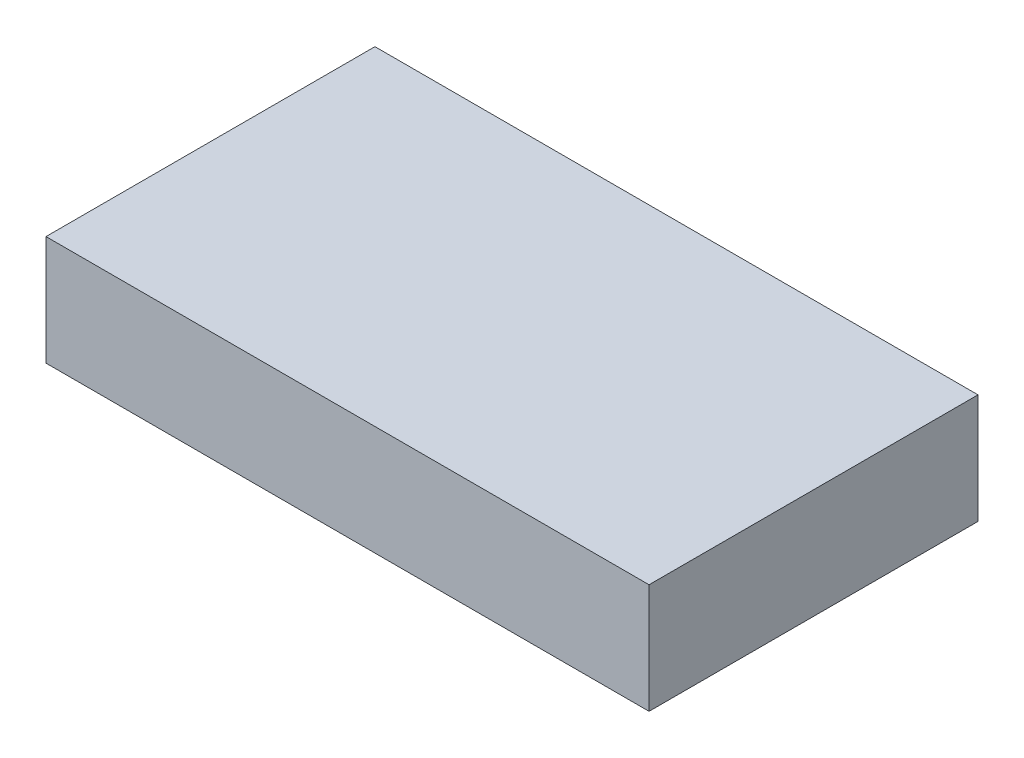
ISO-10303-21;
HEADER;
FILE_DESCRIPTION(('STEP AP214'),'2;1');
FILE_NAME('part.step','',(''),(''),'','','');
FILE_SCHEMA(('AUTOMOTIVE_DESIGN { 1 0 10303 214 1 1 1 1 }'));
ENDSEC;
DATA;
#1=APPLICATION_CONTEXT('core data for automotive mechanical design processes');
#2=APPLICATION_PROTOCOL_DEFINITION('international standard','automotive_design',2000,#1);
#3=PRODUCT_CONTEXT('',#1,'mechanical');
#4=PRODUCT('Part','Part','',(#3));
#5=PRODUCT_RELATED_PRODUCT_CATEGORY('part','',(#4));
#6=PRODUCT_DEFINITION_FORMATION('','',#4);
#7=PRODUCT_DEFINITION_CONTEXT('part definition',#1,'design');
#8=PRODUCT_DEFINITION('design','',#6,#7);
#9=PRODUCT_DEFINITION_SHAPE('','',#8);
#10=(LENGTH_UNIT() NAMED_UNIT(*) SI_UNIT(.MILLI.,.METRE.));
#11=(NAMED_UNIT(*) PLANE_ANGLE_UNIT() SI_UNIT($,.RADIAN.));
#12=(NAMED_UNIT(*) SI_UNIT($,.STERADIAN.) SOLID_ANGLE_UNIT());
#13=UNCERTAINTY_MEASURE_WITH_UNIT(LENGTH_MEASURE(1.E-05),#10,'distance_accuracy_value','');
#14=(GEOMETRIC_REPRESENTATION_CONTEXT(3) GLOBAL_UNCERTAINTY_ASSIGNED_CONTEXT((#13)) GLOBAL_UNIT_ASSIGNED_CONTEXT((#10,
#11,#12)) REPRESENTATION_CONTEXT('',''));
#15=CARTESIAN_POINT('',(0.,0.,0.));
#16=DIRECTION('',(0.,0.,1.));
#17=DIRECTION('',(1.,0.,0.));
#18=AXIS2_PLACEMENT_3D('',#15,#16,#17);
#19=CARTESIAN_POINT('',(0.,10.16,0.));
#20=DIRECTION('',(-1.,0.,0.));
#21=DIRECTION('',(0.,0.,1.));
#22=AXIS2_PLACEMENT_3D('',#19,#20,#21);
#23=PLANE('',#22);
#24=DIRECTION('',(0.,0.,-1.));
#25=VECTOR('',#24,1.);
#26=CARTESIAN_POINT('',(0.,0.,0.));
#27=LINE('',#26,#25);
#28=CARTESIAN_POINT('',(0.,0.,0.));
#29=VERTEX_POINT('',#28);
#30=CARTESIAN_POINT('',(0.,0.,-30.48));
#31=VERTEX_POINT('',#30);
#32=EDGE_CURVE('E106',#29,#31,#27,.T.);
#33=ORIENTED_EDGE('',*,*,#32,.T.);
#34=DIRECTION('',(0.,-1.,0.));
#35=VECTOR('',#34,1.);
#36=CARTESIAN_POINT('',(0.,10.16,-30.48));
#37=LINE('',#36,#35);
#38=CARTESIAN_POINT('',(0.,10.16,-30.48));
#39=VERTEX_POINT('',#38);
#40=EDGE_CURVE('E11',#39,#31,#37,.T.);
#41=ORIENTED_EDGE('',*,*,#40,.F.);
#42=DIRECTION('',(0.,0.,-1.));
#43=VECTOR('',#42,1.);
#44=CARTESIAN_POINT('',(0.,10.16,0.));
#45=LINE('',#44,#43);
#46=CARTESIAN_POINT('',(0.,10.16,0.));
#47=VERTEX_POINT('',#46);
#48=EDGE_CURVE('E94',#47,#39,#45,.T.);
#49=ORIENTED_EDGE('',*,*,#48,.F.);
#50=DIRECTION('',(0.,-1.,0.));
#51=VECTOR('',#50,1.);
#52=CARTESIAN_POINT('',(0.,10.16,0.));
#53=LINE('',#52,#51);
#54=EDGE_CURVE('E102',#47,#29,#53,.T.);
#55=ORIENTED_EDGE('',*,*,#54,.T.);
#56=EDGE_LOOP('',(#33,#41,#49,#55));
#57=FACE_BOUND('',#56,.T.);
#58=ADVANCED_FACE('F43',(#57),#23,.F.);
#59=CARTESIAN_POINT('',(0.,10.16,-30.48));
#60=DIRECTION('',(0.,0.,1.));
#61=DIRECTION('',(1.,0.,0.));
#62=AXIS2_PLACEMENT_3D('',#59,#60,#61);
#63=PLANE('',#62);
#64=DIRECTION('',(-1.,0.,0.));
#65=VECTOR('',#64,1.);
#66=CARTESIAN_POINT('',(0.,0.,-30.48));
#67=LINE('',#66,#65);
#68=CARTESIAN_POINT('',(-55.88,0.,-30.48));
#69=VERTEX_POINT('',#68);
#70=EDGE_CURVE('E98',#31,#69,#67,.T.);
#71=ORIENTED_EDGE('',*,*,#70,.T.);
#72=DIRECTION('',(0.,-1.,0.));
#73=VECTOR('',#72,1.);
#74=CARTESIAN_POINT('',(-55.88,10.16,-30.48));
#75=LINE('',#74,#73);
#76=CARTESIAN_POINT('',(-55.88,10.16,-30.48));
#77=VERTEX_POINT('',#76);
#78=EDGE_CURVE('E51',#77,#69,#75,.T.);
#79=ORIENTED_EDGE('',*,*,#78,.F.);
#80=DIRECTION('',(-1.,0.,0.));
#81=VECTOR('',#80,1.);
#82=CARTESIAN_POINT('',(0.,10.16,-30.48));
#83=LINE('',#82,#81);
#84=EDGE_CURVE('E89',#39,#77,#83,.T.);
#85=ORIENTED_EDGE('',*,*,#84,.F.);
#86=ORIENTED_EDGE('',*,*,#40,.T.);
#87=EDGE_LOOP('',(#71,#79,#85,#86));
#88=FACE_BOUND('',#87,.T.);
#89=ADVANCED_FACE('F97',(#88),#63,.F.);
#90=CARTESIAN_POINT('',(-55.88,10.16,0.));
#91=DIRECTION('',(1.,0.,0.));
#92=DIRECTION('',(0.,0.,-1.));
#93=AXIS2_PLACEMENT_3D('',#90,#91,#92);
#94=PLANE('',#93);
#95=DIRECTION('',(0.,0.,1.));
#96=VECTOR('',#95,1.);
#97=CARTESIAN_POINT('',(-55.88,0.,0.));
#98=LINE('',#97,#96);
#99=CARTESIAN_POINT('',(-55.88,0.,0.));
#100=VERTEX_POINT('',#99);
#101=EDGE_CURVE('E76',#69,#100,#98,.T.);
#102=ORIENTED_EDGE('',*,*,#101,.T.);
#103=DIRECTION('',(0.,-1.,0.));
#104=VECTOR('',#103,1.);
#105=CARTESIAN_POINT('',(-55.88,10.16,0.));
#106=LINE('',#105,#104);
#107=CARTESIAN_POINT('',(-55.88,10.16,0.));
#108=VERTEX_POINT('',#107);
#109=EDGE_CURVE('E99',#108,#100,#106,.T.);
#110=ORIENTED_EDGE('',*,*,#109,.F.);
#111=DIRECTION('',(0.,0.,1.));
#112=VECTOR('',#111,1.);
#113=CARTESIAN_POINT('',(-55.88,10.16,0.));
#114=LINE('',#113,#112);
#115=EDGE_CURVE('E92',#77,#108,#114,.T.);
#116=ORIENTED_EDGE('',*,*,#115,.F.);
#117=ORIENTED_EDGE('',*,*,#78,.T.);
#118=EDGE_LOOP('',(#102,#110,#116,#117));
#119=FACE_BOUND('',#118,.T.);
#120=ADVANCED_FACE('F100',(#119),#94,.F.);
#121=CARTESIAN_POINT('',(0.,10.16,0.));
#122=DIRECTION('',(0.,0.,-1.));
#123=DIRECTION('',(-1.,0.,0.));
#124=AXIS2_PLACEMENT_3D('',#121,#122,#123);
#125=PLANE('',#124);
#126=DIRECTION('',(1.,0.,0.));
#127=VECTOR('',#126,1.);
#128=CARTESIAN_POINT('',(0.,0.,0.));
#129=LINE('',#128,#127);
#130=EDGE_CURVE('E82',#100,#29,#129,.T.);
#131=ORIENTED_EDGE('',*,*,#130,.T.);
#132=ORIENTED_EDGE('',*,*,#54,.F.);
#133=DIRECTION('',(1.,0.,0.));
#134=VECTOR('',#133,1.);
#135=CARTESIAN_POINT('',(0.,10.16,0.));
#136=LINE('',#135,#134);
#137=EDGE_CURVE('E59',#108,#47,#136,.T.);
#138=ORIENTED_EDGE('',*,*,#137,.F.);
#139=ORIENTED_EDGE('',*,*,#109,.T.);
#140=EDGE_LOOP('',(#131,#132,#138,#139));
#141=FACE_BOUND('',#140,.T.);
#142=ADVANCED_FACE('F113',(#141),#125,.F.);
#143=CARTESIAN_POINT('',(0.,10.16,0.));
#144=DIRECTION('',(0.,1.,0.));
#145=DIRECTION('',(0.,0.,1.));
#146=AXIS2_PLACEMENT_3D('',#143,#144,#145);
#147=PLANE('',#146);
#148=ORIENTED_EDGE('',*,*,#48,.T.);
#149=ORIENTED_EDGE('',*,*,#84,.T.);
#150=ORIENTED_EDGE('',*,*,#115,.T.);
#151=ORIENTED_EDGE('',*,*,#137,.T.);
#152=EDGE_LOOP('',(#148,#149,#150,#151));
#153=FACE_BOUND('',#152,.T.);
#154=ADVANCED_FACE('F90',(#153),#147,.T.);
#155=CARTESIAN_POINT('',(0.,0.,0.));
#156=DIRECTION('',(0.,1.,0.));
#157=DIRECTION('',(0.,0.,1.));
#158=AXIS2_PLACEMENT_3D('',#155,#156,#157);
#159=PLANE('',#158);
#160=ORIENTED_EDGE('',*,*,#32,.F.);
#161=ORIENTED_EDGE('',*,*,#130,.F.);
#162=ORIENTED_EDGE('',*,*,#101,.F.);
#163=ORIENTED_EDGE('',*,*,#70,.F.);
#164=EDGE_LOOP('',(#160,#161,#162,#163));
#165=FACE_BOUND('',#164,.T.);
#166=ADVANCED_FACE('F116',(#165),#159,.F.);
#167=CLOSED_SHELL('',(#58,#89,#120,#142,#154,#166));
#168=MANIFOLD_SOLID_BREP('B2',#167);
#169=ADVANCED_BREP_SHAPE_REPRESENTATION('',(#18,#168),#14);
#170=SHAPE_DEFINITION_REPRESENTATION(#9,#169);
ENDSEC;
END-ISO-10303-21;
